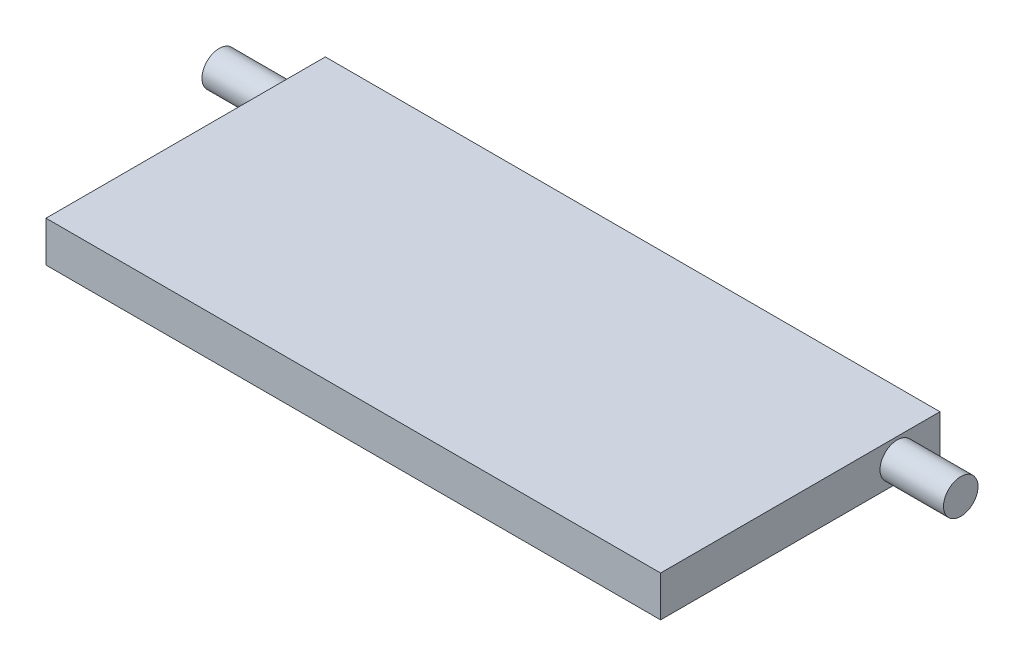
ISO-10303-21;
HEADER;
FILE_DESCRIPTION(('STEP AP214'),'2;1');
FILE_NAME('part.step','',(''),(''),'','','');
FILE_SCHEMA(('AUTOMOTIVE_DESIGN { 1 0 10303 214 1 1 1 1 }'));
ENDSEC;
DATA;
#1=APPLICATION_CONTEXT('core data for automotive mechanical design processes');
#2=APPLICATION_PROTOCOL_DEFINITION('international standard','automotive_design',2000,#1);
#3=PRODUCT_CONTEXT('',#1,'mechanical');
#4=PRODUCT('Part','Part','',(#3));
#5=PRODUCT_RELATED_PRODUCT_CATEGORY('part','',(#4));
#6=PRODUCT_DEFINITION_FORMATION('','',#4);
#7=PRODUCT_DEFINITION_CONTEXT('part definition',#1,'design');
#8=PRODUCT_DEFINITION('design','',#6,#7);
#9=PRODUCT_DEFINITION_SHAPE('','',#8);
#10=(LENGTH_UNIT() NAMED_UNIT(*) SI_UNIT(.MILLI.,.METRE.));
#11=(NAMED_UNIT(*) PLANE_ANGLE_UNIT() SI_UNIT($,.RADIAN.));
#12=(NAMED_UNIT(*) SI_UNIT($,.STERADIAN.) SOLID_ANGLE_UNIT());
#13=UNCERTAINTY_MEASURE_WITH_UNIT(LENGTH_MEASURE(1.E-05),#10,'distance_accuracy_value','');
#14=(GEOMETRIC_REPRESENTATION_CONTEXT(3) GLOBAL_UNCERTAINTY_ASSIGNED_CONTEXT((#13)) GLOBAL_UNIT_ASSIGNED_CONTEXT((#10,
#11,#12)) REPRESENTATION_CONTEXT('',''));
#15=CARTESIAN_POINT('',(0.,0.,0.));
#16=DIRECTION('',(0.,0.,1.));
#17=DIRECTION('',(1.,0.,0.));
#18=AXIS2_PLACEMENT_3D('',#15,#16,#17);
#19=CARTESIAN_POINT('',(60.5,4.,0.));
#20=DIRECTION('',(1.,0.,0.));
#21=DIRECTION('',(0.,0.,-1.));
#22=AXIS2_PLACEMENT_3D('',#19,#20,#21);
#23=PLANE('',#22);
#24=CARTESIAN_POINT('',(60.5,0.,-19.1));
#25=DIRECTION('',(-1.,0.,0.));
#26=DIRECTION('',(0.,0.,1.));
#27=AXIS2_PLACEMENT_3D('',#24,#25,#26);
#28=CIRCLE('',#27,3.4);
#29=CARTESIAN_POINT('',(60.5,0.,-15.7));
#30=VERTEX_POINT('',#29);
#31=EDGE_CURVE('E134',#30,#30,#28,.T.);
#32=ORIENTED_EDGE('',*,*,#31,.T.);
#33=EDGE_LOOP('',(#32));
#34=FACE_BOUND('',#33,.T.);
#35=DIRECTION('',(0.,0.,1.));
#36=VECTOR('',#35,1.);
#37=CARTESIAN_POINT('',(60.5,-4.,0.));
#38=LINE('',#37,#36);
#39=CARTESIAN_POINT('',(60.5,-4.,-27.5));
#40=VERTEX_POINT('',#39);
#41=CARTESIAN_POINT('',(60.5,-4.,27.5));
#42=VERTEX_POINT('',#41);
#43=EDGE_CURVE('E104',#40,#42,#38,.T.);
#44=ORIENTED_EDGE('',*,*,#43,.F.);
#45=DIRECTION('',(0.,-1.,0.));
#46=VECTOR('',#45,1.);
#47=CARTESIAN_POINT('',(60.5,4.,-27.5));
#48=LINE('',#47,#46);
#49=CARTESIAN_POINT('',(60.5,4.,-27.5));
#50=VERTEX_POINT('',#49);
#51=EDGE_CURVE('E45',#50,#40,#48,.T.);
#52=ORIENTED_EDGE('',*,*,#51,.F.);
#53=DIRECTION('',(0.,0.,1.));
#54=VECTOR('',#53,1.);
#55=CARTESIAN_POINT('',(60.5,4.,0.));
#56=LINE('',#55,#54);
#57=CARTESIAN_POINT('',(60.5,4.,27.5));
#58=VERTEX_POINT('',#57);
#59=EDGE_CURVE('E97',#50,#58,#56,.T.);
#60=ORIENTED_EDGE('',*,*,#59,.T.);
#61=DIRECTION('',(0.,-1.,0.));
#62=VECTOR('',#61,1.);
#63=CARTESIAN_POINT('',(60.5,4.,27.5));
#64=LINE('',#63,#62);
#65=EDGE_CURVE('E76',#58,#42,#64,.T.);
#66=ORIENTED_EDGE('',*,*,#65,.T.);
#67=EDGE_LOOP('',(#44,#52,#60,#66));
#68=FACE_BOUND('',#67,.T.);
#69=ADVANCED_FACE('F37',(#34,#68),#23,.T.);
#70=CARTESIAN_POINT('',(0.,4.,-27.5));
#71=DIRECTION('',(0.,0.,-1.));
#72=DIRECTION('',(-1.,0.,0.));
#73=AXIS2_PLACEMENT_3D('',#70,#71,#72);
#74=PLANE('',#73);
#75=DIRECTION('',(1.,0.,0.));
#76=VECTOR('',#75,1.);
#77=CARTESIAN_POINT('',(0.,-4.,-27.5));
#78=LINE('',#77,#76);
#79=CARTESIAN_POINT('',(-60.5,-4.,-27.5));
#80=VERTEX_POINT('',#79);
#81=EDGE_CURVE('E90',#80,#40,#78,.T.);
#82=ORIENTED_EDGE('',*,*,#81,.F.);
#83=DIRECTION('',(0.,-1.,0.));
#84=VECTOR('',#83,1.);
#85=CARTESIAN_POINT('',(-60.5,4.,-27.5));
#86=LINE('',#85,#84);
#87=CARTESIAN_POINT('',(-60.5,4.,-27.5));
#88=VERTEX_POINT('',#87);
#89=EDGE_CURVE('E84',#88,#80,#86,.T.);
#90=ORIENTED_EDGE('',*,*,#89,.F.);
#91=DIRECTION('',(1.,0.,0.));
#92=VECTOR('',#91,1.);
#93=CARTESIAN_POINT('',(0.,4.,-27.5));
#94=LINE('',#93,#92);
#95=EDGE_CURVE('E88',#88,#50,#94,.T.);
#96=ORIENTED_EDGE('',*,*,#95,.T.);
#97=ORIENTED_EDGE('',*,*,#51,.T.);
#98=EDGE_LOOP('',(#82,#90,#96,#97));
#99=FACE_BOUND('',#98,.T.);
#100=ADVANCED_FACE('F86',(#99),#74,.T.);
#101=CARTESIAN_POINT('',(-60.5,4.,0.));
#102=DIRECTION('',(1.,0.,0.));
#103=DIRECTION('',(0.,0.,-1.));
#104=AXIS2_PLACEMENT_3D('',#101,#102,#103);
#105=PLANE('',#104);
#106=CARTESIAN_POINT('',(-60.5,0.,-19.1));
#107=DIRECTION('',(1.,0.,0.));
#108=DIRECTION('',(0.,0.,-1.));
#109=AXIS2_PLACEMENT_3D('',#106,#107,#108);
#110=CIRCLE('',#109,3.4);
#111=CARTESIAN_POINT('',(-60.5,0.,-22.5));
#112=VERTEX_POINT('',#111);
#113=EDGE_CURVE('E11',#112,#112,#110,.F.);
#114=ORIENTED_EDGE('',*,*,#113,.F.);
#115=EDGE_LOOP('',(#114));
#116=FACE_BOUND('',#115,.T.);
#117=DIRECTION('',(0.,0.,1.));
#118=VECTOR('',#117,1.);
#119=CARTESIAN_POINT('',(-60.5,-4.,0.));
#120=LINE('',#119,#118);
#121=CARTESIAN_POINT('',(-60.5,-4.,27.5));
#122=VERTEX_POINT('',#121);
#123=EDGE_CURVE('E69',#80,#122,#120,.T.);
#124=ORIENTED_EDGE('',*,*,#123,.T.);
#125=DIRECTION('',(0.,-1.,0.));
#126=VECTOR('',#125,1.);
#127=CARTESIAN_POINT('',(-60.5,4.,27.5));
#128=LINE('',#127,#126);
#129=CARTESIAN_POINT('',(-60.5,4.,27.5));
#130=VERTEX_POINT('',#129);
#131=EDGE_CURVE('E91',#130,#122,#128,.T.);
#132=ORIENTED_EDGE('',*,*,#131,.F.);
#133=DIRECTION('',(0.,0.,1.));
#134=VECTOR('',#133,1.);
#135=CARTESIAN_POINT('',(-60.5,4.,0.));
#136=LINE('',#135,#134);
#137=EDGE_CURVE('E93',#88,#130,#136,.T.);
#138=ORIENTED_EDGE('',*,*,#137,.F.);
#139=ORIENTED_EDGE('',*,*,#89,.T.);
#140=EDGE_LOOP('',(#124,#132,#138,#139));
#141=FACE_BOUND('',#140,.T.);
#142=ADVANCED_FACE('F94',(#116,#141),#105,.F.);
#143=CARTESIAN_POINT('',(0.,4.,27.5));
#144=DIRECTION('',(0.,0.,-1.));
#145=DIRECTION('',(-1.,0.,0.));
#146=AXIS2_PLACEMENT_3D('',#143,#144,#145);
#147=PLANE('',#146);
#148=DIRECTION('',(1.,0.,0.));
#149=VECTOR('',#148,1.);
#150=CARTESIAN_POINT('',(0.,-4.,27.5));
#151=LINE('',#150,#149);
#152=EDGE_CURVE('E99',#122,#42,#151,.T.);
#153=ORIENTED_EDGE('',*,*,#152,.T.);
#154=ORIENTED_EDGE('',*,*,#65,.F.);
#155=DIRECTION('',(1.,0.,0.));
#156=VECTOR('',#155,1.);
#157=CARTESIAN_POINT('',(0.,4.,27.5));
#158=LINE('',#157,#156);
#159=EDGE_CURVE('E53',#130,#58,#158,.T.);
#160=ORIENTED_EDGE('',*,*,#159,.F.);
#161=ORIENTED_EDGE('',*,*,#131,.T.);
#162=EDGE_LOOP('',(#153,#154,#160,#161));
#163=FACE_BOUND('',#162,.T.);
#164=ADVANCED_FACE('F116',(#163),#147,.F.);
#165=CARTESIAN_POINT('',(0.,4.,0.));
#166=DIRECTION('',(0.,1.,0.));
#167=DIRECTION('',(0.,0.,1.));
#168=AXIS2_PLACEMENT_3D('',#165,#166,#167);
#169=PLANE('',#168);
#170=ORIENTED_EDGE('',*,*,#59,.F.);
#171=ORIENTED_EDGE('',*,*,#95,.F.);
#172=ORIENTED_EDGE('',*,*,#137,.T.);
#173=ORIENTED_EDGE('',*,*,#159,.T.);
#174=EDGE_LOOP('',(#170,#171,#172,#173));
#175=FACE_BOUND('',#174,.T.);
#176=ADVANCED_FACE('F96',(#175),#169,.T.);
#177=CARTESIAN_POINT('',(0.,-4.,0.));
#178=DIRECTION('',(0.,1.,0.));
#179=DIRECTION('',(0.,0.,1.));
#180=AXIS2_PLACEMENT_3D('',#177,#178,#179);
#181=PLANE('',#180);
#182=ORIENTED_EDGE('',*,*,#43,.T.);
#183=ORIENTED_EDGE('',*,*,#152,.F.);
#184=ORIENTED_EDGE('',*,*,#123,.F.);
#185=ORIENTED_EDGE('',*,*,#81,.T.);
#186=EDGE_LOOP('',(#182,#183,#184,#185));
#187=FACE_BOUND('',#186,.T.);
#188=ADVANCED_FACE('F114',(#187),#181,.F.);
#189=CARTESIAN_POINT('',(-73.,0.,0.));
#190=DIRECTION('',(1.,0.,0.));
#191=DIRECTION('',(0.,0.,-1.));
#192=AXIS2_PLACEMENT_3D('',#189,#190,#191);
#193=PLANE('',#192);
#194=CARTESIAN_POINT('',(-73.,0.,-19.1));
#195=DIRECTION('',(-1.,0.,0.));
#196=DIRECTION('',(0.,0.,1.));
#197=AXIS2_PLACEMENT_3D('',#194,#195,#196);
#198=CIRCLE('',#197,3.4);
#199=CARTESIAN_POINT('',(-73.,0.,-15.7));
#200=VERTEX_POINT('',#199);
#201=EDGE_CURVE('E107',#200,#200,#198,.T.);
#202=ORIENTED_EDGE('',*,*,#201,.T.);
#203=EDGE_LOOP('',(#202));
#204=FACE_BOUND('',#203,.T.);
#205=ADVANCED_FACE('F154',(#204),#193,.F.);
#206=CARTESIAN_POINT('',(-73.,0.,-19.1));
#207=DIRECTION('',(-1.,0.,0.));
#208=DIRECTION('',(0.,0.,1.));
#209=AXIS2_PLACEMENT_3D('',#206,#207,#208);
#210=CYLINDRICAL_SURFACE('',#209,3.4);
#211=ORIENTED_EDGE('',*,*,#201,.F.);
#212=EDGE_LOOP('',(#211));
#213=FACE_BOUND('',#212,.T.);
#214=ORIENTED_EDGE('',*,*,#113,.T.);
#215=EDGE_LOOP('',(#214));
#216=FACE_BOUND('',#215,.T.);
#217=ADVANCED_FACE('F147',(#213,#216),#210,.T.);
#218=CARTESIAN_POINT('',(73.,0.,0.));
#219=DIRECTION('',(-1.,0.,0.));
#220=DIRECTION('',(0.,0.,-1.));
#221=AXIS2_PLACEMENT_3D('',#218,#219,#220);
#222=PLANE('',#221);
#223=CARTESIAN_POINT('',(73.,0.,-19.1));
#224=DIRECTION('',(-1.,0.,0.));
#225=DIRECTION('',(0.,0.,1.));
#226=AXIS2_PLACEMENT_3D('',#223,#224,#225);
#227=CIRCLE('',#226,3.4);
#228=CARTESIAN_POINT('',(73.,0.,-15.7));
#229=VERTEX_POINT('',#228);
#230=EDGE_CURVE('E136',#229,#229,#227,.T.);
#231=ORIENTED_EDGE('',*,*,#230,.F.);
#232=EDGE_LOOP('',(#231));
#233=FACE_BOUND('',#232,.T.);
#234=ADVANCED_FACE('F145',(#233),#222,.F.);
#235=CARTESIAN_POINT('',(73.,0.,-19.1));
#236=DIRECTION('',(1.,0.,0.));
#237=DIRECTION('',(0.,0.,1.));
#238=AXIS2_PLACEMENT_3D('',#235,#236,#237);
#239=CYLINDRICAL_SURFACE('',#238,3.4);
#240=ORIENTED_EDGE('',*,*,#230,.T.);
#241=EDGE_LOOP('',(#240));
#242=FACE_BOUND('',#241,.T.);
#243=ORIENTED_EDGE('',*,*,#31,.F.);
#244=EDGE_LOOP('',(#243));
#245=FACE_BOUND('',#244,.T.);
#246=ADVANCED_FACE('F143',(#242,#245),#239,.T.);
#247=CLOSED_SHELL('',(#69,#100,#142,#164,#176,#188,#205,#217,#234,#246));
#248=MANIFOLD_SOLID_BREP('B2',#247);
#249=ADVANCED_BREP_SHAPE_REPRESENTATION('',(#18,#248),#14);
#250=SHAPE_DEFINITION_REPRESENTATION(#9,#249);
ENDSEC;
END-ISO-10303-21;
